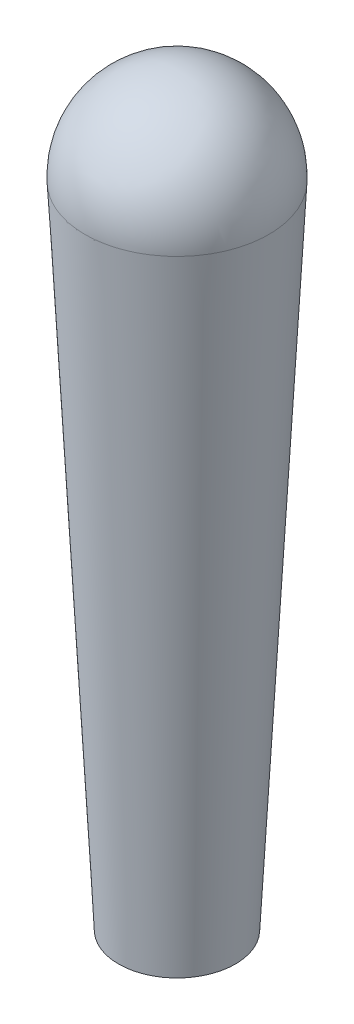
ISO-10303-21;
HEADER;
FILE_DESCRIPTION(('STEP AP214'),'2;1');
FILE_NAME('part.step','',(''),(''),'','','');
FILE_SCHEMA(('AUTOMOTIVE_DESIGN { 1 0 10303 214 1 1 1 1 }'));
ENDSEC;
DATA;
#1=APPLICATION_CONTEXT('core data for automotive mechanical design processes');
#2=APPLICATION_PROTOCOL_DEFINITION('international standard','automotive_design',2000,#1);
#3=PRODUCT_CONTEXT('',#1,'mechanical');
#4=PRODUCT('Part','Part','',(#3));
#5=PRODUCT_RELATED_PRODUCT_CATEGORY('part','',(#4));
#6=PRODUCT_DEFINITION_FORMATION('','',#4);
#7=PRODUCT_DEFINITION_CONTEXT('part definition',#1,'design');
#8=PRODUCT_DEFINITION('design','',#6,#7);
#9=PRODUCT_DEFINITION_SHAPE('','',#8);
#10=(LENGTH_UNIT() NAMED_UNIT(*) SI_UNIT(.MILLI.,.METRE.));
#11=(NAMED_UNIT(*) PLANE_ANGLE_UNIT() SI_UNIT($,.RADIAN.));
#12=(NAMED_UNIT(*) SI_UNIT($,.STERADIAN.) SOLID_ANGLE_UNIT());
#13=UNCERTAINTY_MEASURE_WITH_UNIT(LENGTH_MEASURE(1.E-05),#10,'distance_accuracy_value','');
#14=(GEOMETRIC_REPRESENTATION_CONTEXT(3) GLOBAL_UNCERTAINTY_ASSIGNED_CONTEXT((#13)) GLOBAL_UNIT_ASSIGNED_CONTEXT((#10,
#11,#12)) REPRESENTATION_CONTEXT('',''));
#15=CARTESIAN_POINT('',(0.,0.,0.));
#16=DIRECTION('',(0.,0.,1.));
#17=DIRECTION('',(1.,0.,0.));
#18=AXIS2_PLACEMENT_3D('',#15,#16,#17);
#19=CARTESIAN_POINT('',(0.,-3.7719,-1.905));
#20=DIRECTION('',(0.,1.,0.));
#21=DIRECTION('',(0.,0.,1.));
#22=AXIS2_PLACEMENT_3D('',#19,#20,#21);
#23=PLANE('',#22);
#24=CARTESIAN_POINT('',(0.,-3.77190000000382,0.));
#25=DIRECTION('',(0.,1.,0.));
#26=DIRECTION('',(0.,0.,1.));
#27=AXIS2_PLACEMENT_3D('',#24,#25,#26);
#28=CIRCLE('',#27,1.90500000000134);
#29=CARTESIAN_POINT('',(0.,-3.77190000000382,1.90500000000134));
#30=VERTEX_POINT('',#29);
#31=EDGE_CURVE('E20',#30,#30,#28,.T.);
#32=ORIENTED_EDGE('',*,*,#31,.F.);
#33=EDGE_LOOP('',(#32));
#34=FACE_BOUND('',#33,.T.);
#35=ADVANCED_FACE('F17',(#34),#23,.F.);
#36=CARTESIAN_POINT('',(0.,17.5133,0.));
#37=DIRECTION('',(0.,0.,-1.));
#38=DIRECTION('',(1.,0.,0.));
#39=AXIS2_PLACEMENT_3D('',#36,#37,#38);
#40=SPHERICAL_SURFACE('',#39,2.9972);
#41=CARTESIAN_POINT('',(0.,17.5133,2.9972));
#42=VERTEX_POINT('',#41);
#43=VERTEX_LOOP('',#42);
#44=FACE_BOUND('',#43,.T.);
#45=CARTESIAN_POINT('',(0.,17.5133,-2.9972));
#46=VERTEX_POINT('',#45);
#47=VERTEX_LOOP('',#46);
#48=FACE_BOUND('',#47,.T.);
#49=CARTESIAN_POINT('',(0.,17.359150716743,0.));
#50=DIRECTION('',(0.,1.,0.));
#51=DIRECTION('',(0.,0.,1.));
#52=AXIS2_PLACEMENT_3D('',#49,#50,#51);
#53=CIRCLE('',#52,2.99323334180102);
#54=CARTESIAN_POINT('',(0.,17.359150716743,2.99323334180102));
#55=VERTEX_POINT('',#54);
#56=EDGE_CURVE('E11',#55,#55,#53,.F.);
#57=ORIENTED_EDGE('',*,*,#56,.F.);
#58=EDGE_LOOP('',(#57));
#59=FACE_BOUND('',#58,.T.);
#60=ADVANCED_FACE('F30',(#44,#48,#59),#40,.T.);
#61=CARTESIAN_POINT('',(0.,17.359150716743,0.));
#62=DIRECTION('',(0.,1.,0.));
#63=DIRECTION('',(0.,0.,1.));
#64=AXIS2_PLACEMENT_3D('',#61,#62,#63);
#65=CONICAL_SURFACE('',#64,2.99323334180102,0.0514537976996379);
#66=ORIENTED_EDGE('',*,*,#56,.T.);
#67=EDGE_LOOP('',(#66));
#68=FACE_BOUND('',#67,.T.);
#69=ORIENTED_EDGE('',*,*,#31,.T.);
#70=EDGE_LOOP('',(#69));
#71=FACE_BOUND('',#70,.T.);
#72=ADVANCED_FACE('F33',(#68,#71),#65,.T.);
#73=CLOSED_SHELL('',(#35,#60,#72));
#74=MANIFOLD_SOLID_BREP('B1',#73);
#75=ADVANCED_BREP_SHAPE_REPRESENTATION('',(#18,#74),#14);
#76=SHAPE_DEFINITION_REPRESENTATION(#9,#75);
ENDSEC;
END-ISO-10303-21;
